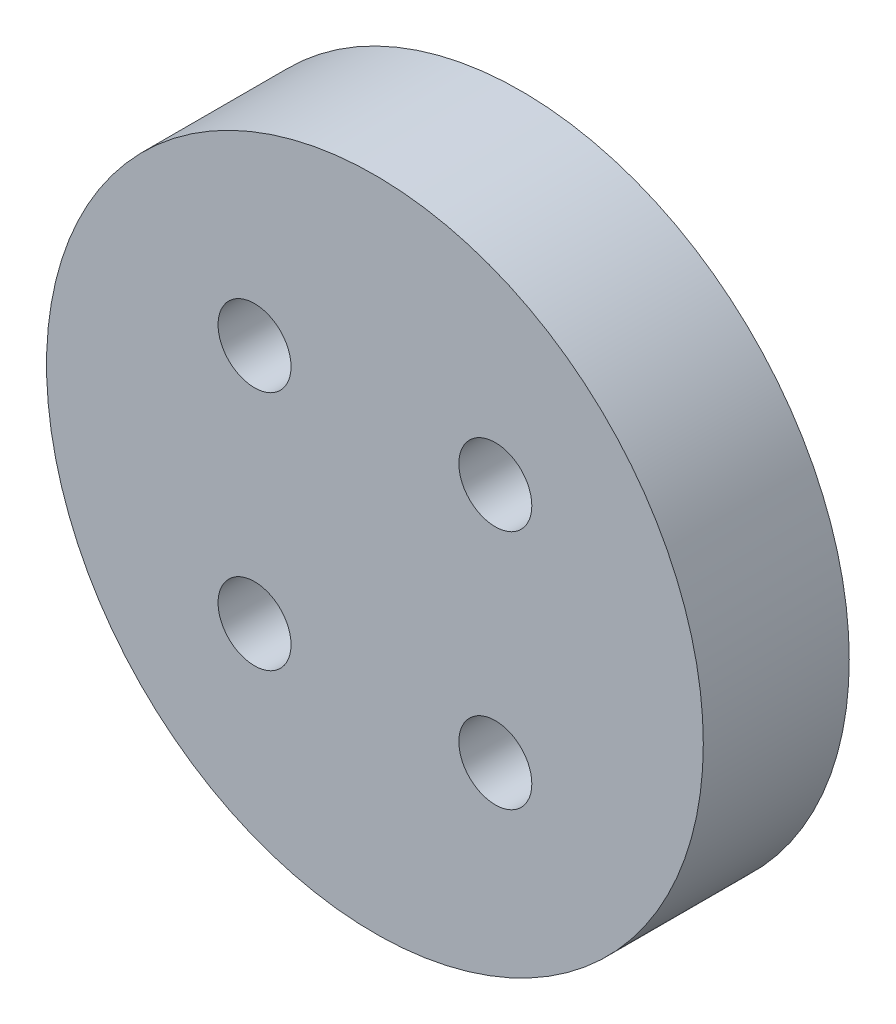
ISO-10303-21;
HEADER;
FILE_DESCRIPTION(('STEP AP214'),'2;1');
FILE_NAME('part.step','',(''),(''),'','','');
FILE_SCHEMA(('AUTOMOTIVE_DESIGN { 1 0 10303 214 1 1 1 1 }'));
ENDSEC;
DATA;
#1=APPLICATION_CONTEXT('core data for automotive mechanical design processes');
#2=APPLICATION_PROTOCOL_DEFINITION('international standard','automotive_design',2000,#1);
#3=PRODUCT_CONTEXT('',#1,'mechanical');
#4=PRODUCT('Part','Part','',(#3));
#5=PRODUCT_RELATED_PRODUCT_CATEGORY('part','',(#4));
#6=PRODUCT_DEFINITION_FORMATION('','',#4);
#7=PRODUCT_DEFINITION_CONTEXT('part definition',#1,'design');
#8=PRODUCT_DEFINITION('design','',#6,#7);
#9=PRODUCT_DEFINITION_SHAPE('','',#8);
#10=(LENGTH_UNIT() NAMED_UNIT(*) SI_UNIT(.MILLI.,.METRE.));
#11=(NAMED_UNIT(*) PLANE_ANGLE_UNIT() SI_UNIT($,.RADIAN.));
#12=(NAMED_UNIT(*) SI_UNIT($,.STERADIAN.) SOLID_ANGLE_UNIT());
#13=UNCERTAINTY_MEASURE_WITH_UNIT(LENGTH_MEASURE(1.E-05),#10,'distance_accuracy_value','');
#14=(GEOMETRIC_REPRESENTATION_CONTEXT(3) GLOBAL_UNCERTAINTY_ASSIGNED_CONTEXT((#13)) GLOBAL_UNIT_ASSIGNED_CONTEXT((#10,
#11,#12)) REPRESENTATION_CONTEXT('',''));
#15=CARTESIAN_POINT('',(0.,0.,0.));
#16=DIRECTION('',(0.,0.,1.));
#17=DIRECTION('',(1.,0.,0.));
#18=AXIS2_PLACEMENT_3D('',#15,#16,#17);
#19=CARTESIAN_POINT('',(0.,0.,6.));
#20=DIRECTION('',(0.,0.,-1.));
#21=DIRECTION('',(-1.,0.,0.));
#22=AXIS2_PLACEMENT_3D('',#19,#20,#21);
#23=CYLINDRICAL_SURFACE('',#22,13.5);
#24=CARTESIAN_POINT('',(0.,0.,6.));
#25=DIRECTION('',(0.,0.,1.));
#26=DIRECTION('',(1.,0.,0.));
#27=AXIS2_PLACEMENT_3D('',#24,#25,#26);
#28=CIRCLE('',#27,13.5);
#29=CARTESIAN_POINT('',(13.5,0.,6.));
#30=VERTEX_POINT('',#29);
#31=EDGE_CURVE('E10',#30,#30,#28,.T.);
#32=ORIENTED_EDGE('',*,*,#31,.F.);
#33=EDGE_LOOP('',(#32));
#34=FACE_BOUND('',#33,.T.);
#35=CARTESIAN_POINT('',(0.,0.,0.));
#36=DIRECTION('',(0.,0.,1.));
#37=DIRECTION('',(1.,0.,0.));
#38=AXIS2_PLACEMENT_3D('',#35,#36,#37);
#39=CIRCLE('',#38,13.5);
#40=CARTESIAN_POINT('',(13.5,0.,0.));
#41=VERTEX_POINT('',#40);
#42=EDGE_CURVE('E40',#41,#41,#39,.T.);
#43=ORIENTED_EDGE('',*,*,#42,.T.);
#44=EDGE_LOOP('',(#43));
#45=FACE_BOUND('',#44,.T.);
#46=ADVANCED_FACE('F33',(#34,#45),#23,.T.);
#47=CARTESIAN_POINT('',(0.,0.,6.));
#48=DIRECTION('',(0.,0.,1.));
#49=DIRECTION('',(1.,0.,0.));
#50=AXIS2_PLACEMENT_3D('',#47,#48,#49);
#51=PLANE('',#50);
#52=CARTESIAN_POINT('',(-4.94974746830582,4.94974746830584,6.));
#53=DIRECTION('',(0.,0.,1.));
#54=DIRECTION('',(1.,0.,0.));
#55=AXIS2_PLACEMENT_3D('',#52,#53,#54);
#56=CIRCLE('',#55,1.49999999999999);
#57=CARTESIAN_POINT('',(-3.44974746830583,4.94974746830584,6.));
#58=VERTEX_POINT('',#57);
#59=EDGE_CURVE('E67',#58,#58,#56,.T.);
#60=ORIENTED_EDGE('',*,*,#59,.F.);
#61=EDGE_LOOP('',(#60));
#62=FACE_BOUND('',#61,.T.);
#63=CARTESIAN_POINT('',(-4.94974746830584,-4.94974746830582,6.));
#64=DIRECTION('',(0.,0.,1.));
#65=DIRECTION('',(1.,0.,0.));
#66=AXIS2_PLACEMENT_3D('',#63,#64,#65);
#67=CIRCLE('',#66,1.49999999999999);
#68=CARTESIAN_POINT('',(-3.44974746830585,-4.94974746830582,6.));
#69=VERTEX_POINT('',#68);
#70=EDGE_CURVE('E57',#69,#69,#67,.T.);
#71=ORIENTED_EDGE('',*,*,#70,.F.);
#72=EDGE_LOOP('',(#71));
#73=FACE_BOUND('',#72,.T.);
#74=CARTESIAN_POINT('',(4.94974746830582,-4.94974746830584,6.));
#75=DIRECTION('',(0.,0.,1.));
#76=DIRECTION('',(1.,0.,0.));
#77=AXIS2_PLACEMENT_3D('',#74,#75,#76);
#78=CIRCLE('',#77,1.49999999999999);
#79=CARTESIAN_POINT('',(6.44974746830581,-4.94974746830584,6.));
#80=VERTEX_POINT('',#79);
#81=EDGE_CURVE('E54',#80,#80,#78,.T.);
#82=ORIENTED_EDGE('',*,*,#81,.F.);
#83=EDGE_LOOP('',(#82));
#84=FACE_BOUND('',#83,.T.);
#85=CARTESIAN_POINT('',(4.94974746830584,4.94974746830582,6.));
#86=DIRECTION('',(0.,0.,1.));
#87=DIRECTION('',(1.,0.,0.));
#88=AXIS2_PLACEMENT_3D('',#85,#86,#87);
#89=CIRCLE('',#88,1.49999999999999);
#90=CARTESIAN_POINT('',(6.44974746830583,4.94974746830582,6.));
#91=VERTEX_POINT('',#90);
#92=EDGE_CURVE('E53',#91,#91,#89,.T.);
#93=ORIENTED_EDGE('',*,*,#92,.F.);
#94=EDGE_LOOP('',(#93));
#95=FACE_BOUND('',#94,.T.);
#96=ORIENTED_EDGE('',*,*,#31,.T.);
#97=EDGE_LOOP('',(#96));
#98=FACE_BOUND('',#97,.T.);
#99=ADVANCED_FACE('F91',(#62,#73,#84,#95,#98),#51,.T.);
#100=CARTESIAN_POINT('',(0.,0.,0.));
#101=DIRECTION('',(0.,0.,1.));
#102=DIRECTION('',(1.,0.,0.));
#103=AXIS2_PLACEMENT_3D('',#100,#101,#102);
#104=PLANE('',#103);
#105=CARTESIAN_POINT('',(-4.94974746830582,4.94974746830584,0.));
#106=DIRECTION('',(0.,0.,1.));
#107=DIRECTION('',(1.,0.,0.));
#108=AXIS2_PLACEMENT_3D('',#105,#106,#107);
#109=CIRCLE('',#108,1.49999999999999);
#110=CARTESIAN_POINT('',(-3.44974746830584,4.94974746830584,0.));
#111=VERTEX_POINT('',#110);
#112=EDGE_CURVE('E36',#111,#111,#109,.T.);
#113=ORIENTED_EDGE('',*,*,#112,.T.);
#114=EDGE_LOOP('',(#113));
#115=FACE_BOUND('',#114,.T.);
#116=CARTESIAN_POINT('',(-4.94974746830584,-4.94974746830582,0.));
#117=DIRECTION('',(0.,0.,1.));
#118=DIRECTION('',(1.,0.,0.));
#119=AXIS2_PLACEMENT_3D('',#116,#117,#118);
#120=CIRCLE('',#119,1.49999999999999);
#121=CARTESIAN_POINT('',(-3.44974746830586,-4.94974746830582,0.));
#122=VERTEX_POINT('',#121);
#123=EDGE_CURVE('E55',#122,#122,#120,.T.);
#124=ORIENTED_EDGE('',*,*,#123,.T.);
#125=EDGE_LOOP('',(#124));
#126=FACE_BOUND('',#125,.T.);
#127=CARTESIAN_POINT('',(4.94974746830582,-4.94974746830584,0.));
#128=DIRECTION('',(0.,0.,1.));
#129=DIRECTION('',(1.,0.,0.));
#130=AXIS2_PLACEMENT_3D('',#127,#128,#129);
#131=CIRCLE('',#130,1.49999999999999);
#132=CARTESIAN_POINT('',(6.44974746830581,-4.94974746830584,0.));
#133=VERTEX_POINT('',#132);
#134=EDGE_CURVE('E51',#133,#133,#131,.T.);
#135=ORIENTED_EDGE('',*,*,#134,.T.);
#136=EDGE_LOOP('',(#135));
#137=FACE_BOUND('',#136,.T.);
#138=CARTESIAN_POINT('',(4.94974746830584,4.94974746830582,0.));
#139=DIRECTION('',(0.,0.,1.));
#140=DIRECTION('',(1.,0.,0.));
#141=AXIS2_PLACEMENT_3D('',#138,#139,#140);
#142=CIRCLE('',#141,1.49999999999999);
#143=CARTESIAN_POINT('',(6.44974746830583,4.94974746830582,0.));
#144=VERTEX_POINT('',#143);
#145=EDGE_CURVE('E72',#144,#144,#142,.T.);
#146=ORIENTED_EDGE('',*,*,#145,.T.);
#147=EDGE_LOOP('',(#146));
#148=FACE_BOUND('',#147,.T.);
#149=CARTESIAN_POINT('',(-10.5,0.,0.));
#150=DIRECTION('',(0.,0.,-1.));
#151=DIRECTION('',(-1.,0.,0.));
#152=AXIS2_PLACEMENT_3D('',#149,#150,#151);
#153=CIRCLE('',#152,1.575);
#154=CARTESIAN_POINT('',(-12.075,0.,0.));
#155=VERTEX_POINT('',#154);
#156=EDGE_CURVE('E77',#155,#155,#153,.T.);
#157=ORIENTED_EDGE('',*,*,#156,.F.);
#158=EDGE_LOOP('',(#157));
#159=FACE_BOUND('',#158,.T.);
#160=CARTESIAN_POINT('',(7.5,0.,0.));
#161=DIRECTION('',(0.,0.,-1.));
#162=DIRECTION('',(-1.,0.,0.));
#163=AXIS2_PLACEMENT_3D('',#160,#161,#162);
#164=CIRCLE('',#163,1.575);
#165=CARTESIAN_POINT('',(5.925,0.,0.));
#166=VERTEX_POINT('',#165);
#167=EDGE_CURVE('E48',#166,#166,#164,.T.);
#168=ORIENTED_EDGE('',*,*,#167,.F.);
#169=EDGE_LOOP('',(#168));
#170=FACE_BOUND('',#169,.T.);
#171=ORIENTED_EDGE('',*,*,#42,.F.);
#172=EDGE_LOOP('',(#171));
#173=FACE_BOUND('',#172,.T.);
#174=ADVANCED_FACE('F88',(#115,#126,#137,#148,#159,#170,#173),#104,.F.);
#175=CARTESIAN_POINT('',(7.5,0.,1.8));
#176=DIRECTION('',(0.,0.,-1.));
#177=DIRECTION('',(-1.,0.,0.));
#178=AXIS2_PLACEMENT_3D('',#175,#176,#177);
#179=CYLINDRICAL_SURFACE('',#178,1.575);
#180=CARTESIAN_POINT('',(7.5,0.,1.8));
#181=DIRECTION('',(0.,0.,-1.));
#182=DIRECTION('',(-1.,0.,0.));
#183=AXIS2_PLACEMENT_3D('',#180,#181,#182);
#184=CIRCLE('',#183,1.575);
#185=CARTESIAN_POINT('',(5.925,0.,1.8));
#186=VERTEX_POINT('',#185);
#187=EDGE_CURVE('E79',#186,#186,#184,.T.);
#188=ORIENTED_EDGE('',*,*,#187,.F.);
#189=EDGE_LOOP('',(#188));
#190=FACE_BOUND('',#189,.T.);
#191=ORIENTED_EDGE('',*,*,#167,.T.);
#192=EDGE_LOOP('',(#191));
#193=FACE_BOUND('',#192,.T.);
#194=ADVANCED_FACE('F86',(#190,#193),#179,.F.);
#195=CARTESIAN_POINT('',(7.5,0.,1.8));
#196=DIRECTION('',(0.,0.,-1.));
#197=DIRECTION('',(-1.,0.,0.));
#198=AXIS2_PLACEMENT_3D('',#195,#196,#197);
#199=PLANE('',#198);
#200=ORIENTED_EDGE('',*,*,#187,.T.);
#201=EDGE_LOOP('',(#200));
#202=FACE_BOUND('',#201,.T.);
#203=ADVANCED_FACE('F109',(#202),#199,.T.);
#204=CARTESIAN_POINT('',(-10.5,0.,1.8));
#205=DIRECTION('',(0.,0.,-1.));
#206=DIRECTION('',(-1.,0.,0.));
#207=AXIS2_PLACEMENT_3D('',#204,#205,#206);
#208=CYLINDRICAL_SURFACE('',#207,1.575);
#209=CARTESIAN_POINT('',(-10.5,0.,1.8));
#210=DIRECTION('',(0.,0.,-1.));
#211=DIRECTION('',(-1.,0.,0.));
#212=AXIS2_PLACEMENT_3D('',#209,#210,#211);
#213=CIRCLE('',#212,1.575);
#214=CARTESIAN_POINT('',(-12.075,0.,1.8));
#215=VERTEX_POINT('',#214);
#216=EDGE_CURVE('E45',#215,#215,#213,.T.);
#217=ORIENTED_EDGE('',*,*,#216,.F.);
#218=EDGE_LOOP('',(#217));
#219=FACE_BOUND('',#218,.T.);
#220=ORIENTED_EDGE('',*,*,#156,.T.);
#221=EDGE_LOOP('',(#220));
#222=FACE_BOUND('',#221,.T.);
#223=ADVANCED_FACE('F113',(#219,#222),#208,.F.);
#224=CARTESIAN_POINT('',(-10.5,0.,1.8));
#225=DIRECTION('',(0.,0.,-1.));
#226=DIRECTION('',(-1.,0.,0.));
#227=AXIS2_PLACEMENT_3D('',#224,#225,#226);
#228=PLANE('',#227);
#229=ORIENTED_EDGE('',*,*,#216,.T.);
#230=EDGE_LOOP('',(#229));
#231=FACE_BOUND('',#230,.T.);
#232=ADVANCED_FACE('F116',(#231),#228,.T.);
#233=CARTESIAN_POINT('',(4.94974746830584,4.94974746830582,6.));
#234=DIRECTION('',(0.,0.,1.));
#235=DIRECTION('',(1.,0.,0.));
#236=AXIS2_PLACEMENT_3D('',#233,#234,#235);
#237=CYLINDRICAL_SURFACE('',#236,1.49999999999999);
#238=ORIENTED_EDGE('',*,*,#92,.T.);
#239=EDGE_LOOP('',(#238));
#240=FACE_BOUND('',#239,.T.);
#241=ORIENTED_EDGE('',*,*,#145,.F.);
#242=EDGE_LOOP('',(#241));
#243=FACE_BOUND('',#242,.T.);
#244=ADVANCED_FACE('F120',(#240,#243),#237,.F.);
#245=CARTESIAN_POINT('',(4.94974746830582,-4.94974746830584,6.));
#246=DIRECTION('',(0.,0.,1.));
#247=DIRECTION('',(1.,0.,0.));
#248=AXIS2_PLACEMENT_3D('',#245,#246,#247);
#249=CYLINDRICAL_SURFACE('',#248,1.49999999999999);
#250=ORIENTED_EDGE('',*,*,#81,.T.);
#251=EDGE_LOOP('',(#250));
#252=FACE_BOUND('',#251,.T.);
#253=ORIENTED_EDGE('',*,*,#134,.F.);
#254=EDGE_LOOP('',(#253));
#255=FACE_BOUND('',#254,.T.);
#256=ADVANCED_FACE('F124',(#252,#255),#249,.F.);
#257=CARTESIAN_POINT('',(-4.94974746830584,-4.94974746830582,6.));
#258=DIRECTION('',(0.,0.,1.));
#259=DIRECTION('',(1.,0.,0.));
#260=AXIS2_PLACEMENT_3D('',#257,#258,#259);
#261=CYLINDRICAL_SURFACE('',#260,1.49999999999999);
#262=ORIENTED_EDGE('',*,*,#70,.T.);
#263=EDGE_LOOP('',(#262));
#264=FACE_BOUND('',#263,.T.);
#265=ORIENTED_EDGE('',*,*,#123,.F.);
#266=EDGE_LOOP('',(#265));
#267=FACE_BOUND('',#266,.T.);
#268=ADVANCED_FACE('F128',(#264,#267),#261,.F.);
#269=CARTESIAN_POINT('',(-4.94974746830582,4.94974746830584,6.));
#270=DIRECTION('',(0.,0.,1.));
#271=DIRECTION('',(1.,0.,0.));
#272=AXIS2_PLACEMENT_3D('',#269,#270,#271);
#273=CYLINDRICAL_SURFACE('',#272,1.49999999999999);
#274=ORIENTED_EDGE('',*,*,#59,.T.);
#275=EDGE_LOOP('',(#274));
#276=FACE_BOUND('',#275,.T.);
#277=ORIENTED_EDGE('',*,*,#112,.F.);
#278=EDGE_LOOP('',(#277));
#279=FACE_BOUND('',#278,.T.);
#280=ADVANCED_FACE('F132',(#276,#279),#273,.F.);
#281=CLOSED_SHELL('',(#46,#99,#174,#194,#203,#223,#232,#244,#256,#268,#280));
#282=MANIFOLD_SOLID_BREP('B2',#281);
#283=ADVANCED_BREP_SHAPE_REPRESENTATION('',(#18,#282),#14);
#284=SHAPE_DEFINITION_REPRESENTATION(#9,#283);
ENDSEC;
END-ISO-10303-21;
